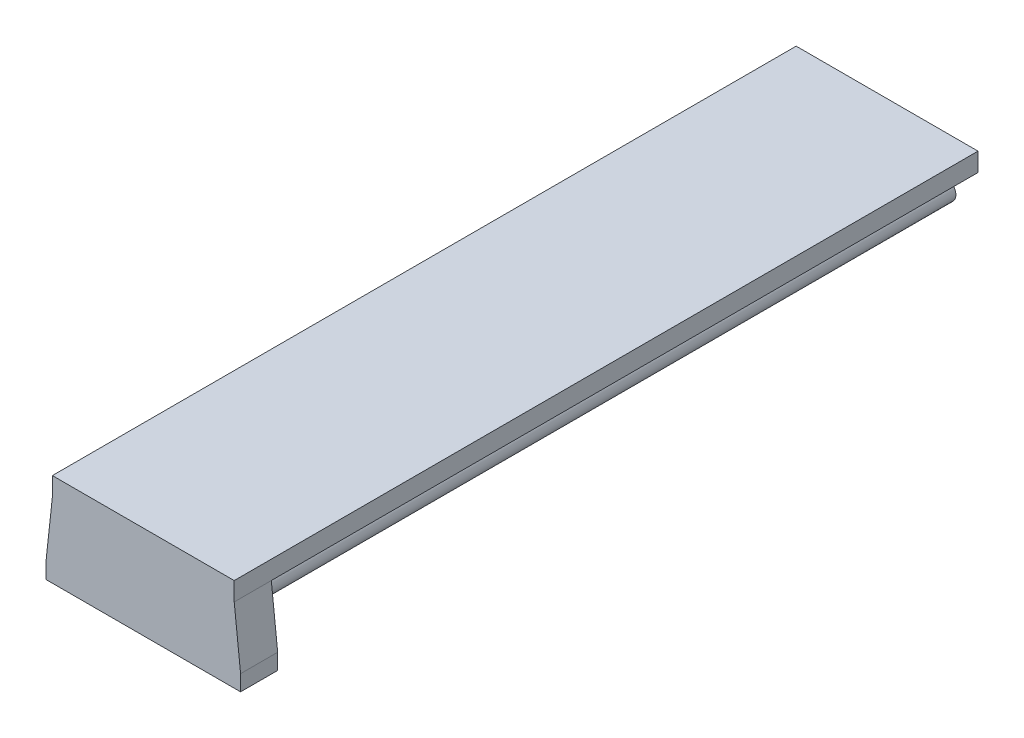
ISO-10303-21;
HEADER;
FILE_DESCRIPTION(('STEP AP214'),'2;1');
FILE_NAME('part.step','',(''),(''),'','','');
FILE_SCHEMA(('AUTOMOTIVE_DESIGN { 1 0 10303 214 1 1 1 1 }'));
ENDSEC;
DATA;
#1=APPLICATION_CONTEXT('core data for automotive mechanical design processes');
#2=APPLICATION_PROTOCOL_DEFINITION('international standard','automotive_design',2000,#1);
#3=PRODUCT_CONTEXT('',#1,'mechanical');
#4=PRODUCT('Part','Part','',(#3));
#5=PRODUCT_RELATED_PRODUCT_CATEGORY('part','',(#4));
#6=PRODUCT_DEFINITION_FORMATION('','',#4);
#7=PRODUCT_DEFINITION_CONTEXT('part definition',#1,'design');
#8=PRODUCT_DEFINITION('design','',#6,#7);
#9=PRODUCT_DEFINITION_SHAPE('','',#8);
#10=(LENGTH_UNIT() NAMED_UNIT(*) SI_UNIT(.MILLI.,.METRE.));
#11=(NAMED_UNIT(*) PLANE_ANGLE_UNIT() SI_UNIT($,.RADIAN.));
#12=(NAMED_UNIT(*) SI_UNIT($,.STERADIAN.) SOLID_ANGLE_UNIT());
#13=UNCERTAINTY_MEASURE_WITH_UNIT(LENGTH_MEASURE(1.E-05),#10,'distance_accuracy_value','');
#14=(GEOMETRIC_REPRESENTATION_CONTEXT(3) GLOBAL_UNCERTAINTY_ASSIGNED_CONTEXT((#13)) GLOBAL_UNIT_ASSIGNED_CONTEXT((#10,
#11,#12)) REPRESENTATION_CONTEXT('',''));
#15=CARTESIAN_POINT('',(0.,0.,0.));
#16=DIRECTION('',(0.,0.,1.));
#17=DIRECTION('',(1.,0.,0.));
#18=AXIS2_PLACEMENT_3D('',#15,#16,#17);
#19=CARTESIAN_POINT('',(0.,10.4902,-76.2));
#20=DIRECTION('',(0.,-1.,0.));
#21=DIRECTION('',(1.,0.,0.));
#22=AXIS2_PLACEMENT_3D('',#19,#20,#21);
#23=PLANE('',#22);
#24=DIRECTION('',(1.,0.,0.));
#25=VECTOR('',#24,1.);
#26=CARTESIAN_POINT('',(0.,10.4902,0.));
#27=LINE('',#26,#25);
#28=CARTESIAN_POINT('',(-6.34847801870124,10.4902,0.));
#29=VERTEX_POINT('',#28);
#30=CARTESIAN_POINT('',(-4.19036499999997,10.4902,0.));
#31=VERTEX_POINT('',#30);
#32=EDGE_CURVE('E227',#29,#31,#27,.T.);
#33=ORIENTED_EDGE('',*,*,#32,.T.);
#34=DIRECTION('',(0.,0.,1.));
#35=VECTOR('',#34,1.);
#36=CARTESIAN_POINT('',(-4.19036499999997,10.4902,-76.2));
#37=LINE('',#36,#35);
#38=CARTESIAN_POINT('',(-4.19036499999997,10.4902,-76.2));
#39=VERTEX_POINT('',#38);
#40=EDGE_CURVE('E11',#39,#31,#37,.T.);
#41=ORIENTED_EDGE('',*,*,#40,.F.);
#42=DIRECTION('',(1.,0.,0.));
#43=VECTOR('',#42,1.);
#44=CARTESIAN_POINT('',(0.,10.4902,-76.2));
#45=LINE('',#44,#43);
#46=CARTESIAN_POINT('',(-6.34847801870124,10.4902,-76.2));
#47=VERTEX_POINT('',#46);
#48=EDGE_CURVE('E236',#47,#39,#45,.T.);
#49=ORIENTED_EDGE('',*,*,#48,.F.);
#50=DIRECTION('',(0.,0.,1.));
#51=VECTOR('',#50,1.);
#52=CARTESIAN_POINT('',(-6.34847801870124,10.4902,-76.2));
#53=LINE('',#52,#51);
#54=EDGE_CURVE('E42',#47,#29,#53,.T.);
#55=ORIENTED_EDGE('',*,*,#54,.T.);
#56=EDGE_LOOP('',(#33,#41,#49,#55));
#57=FACE_BOUND('',#56,.T.);
#58=ADVANCED_FACE('F39',(#57),#23,.F.);
#59=CARTESIAN_POINT('',(-4.19036499999997,11.429365,-76.2));
#60=DIRECTION('',(0.,0.,1.));
#61=DIRECTION('',(1.,0.,0.));
#62=AXIS2_PLACEMENT_3D('',#59,#60,#61);
#63=CYLINDRICAL_SURFACE('',#62,0.939165);
#64=CARTESIAN_POINT('',(-4.19036499999997,11.429365,0.));
#65=DIRECTION('',(0.,0.,1.));
#66=DIRECTION('',(1.,0.,0.));
#67=AXIS2_PLACEMENT_3D('',#64,#65,#66);
#68=CIRCLE('',#67,0.939165);
#69=CARTESIAN_POINT('',(-3.25119999999997,11.429365,0.));
#70=VERTEX_POINT('',#69);
#71=EDGE_CURVE('E239',#31,#70,#68,.T.);
#72=ORIENTED_EDGE('',*,*,#71,.T.);
#73=DIRECTION('',(0.,0.,1.));
#74=VECTOR('',#73,1.);
#75=CARTESIAN_POINT('',(-3.25119999999997,11.429365,-76.2));
#76=LINE('',#75,#74);
#77=CARTESIAN_POINT('',(-3.25119999999997,11.429365,-76.2));
#78=VERTEX_POINT('',#77);
#79=EDGE_CURVE('E48',#78,#70,#76,.T.);
#80=ORIENTED_EDGE('',*,*,#79,.F.);
#81=CARTESIAN_POINT('',(-4.19036499999997,11.429365,-76.2));
#82=DIRECTION('',(0.,0.,1.));
#83=DIRECTION('',(1.,0.,0.));
#84=AXIS2_PLACEMENT_3D('',#81,#82,#83);
#85=CIRCLE('',#84,0.939165);
#86=EDGE_CURVE('E55',#39,#78,#85,.T.);
#87=ORIENTED_EDGE('',*,*,#86,.F.);
#88=ORIENTED_EDGE('',*,*,#40,.T.);
#89=EDGE_LOOP('',(#72,#80,#87,#88));
#90=FACE_BOUND('',#89,.T.);
#91=ADVANCED_FACE('F383',(#90),#63,.F.);
#92=CARTESIAN_POINT('',(-3.25119999999994,0.,-76.2));
#93=DIRECTION('',(1.,0.,0.));
#94=DIRECTION('',(0.,1.,0.));
#95=AXIS2_PLACEMENT_3D('',#92,#93,#94);
#96=PLANE('',#95);
#97=DIRECTION('',(0.,1.,0.));
#98=VECTOR('',#97,1.);
#99=CARTESIAN_POINT('',(-3.25119999999994,0.,0.));
#100=LINE('',#99,#98);
#101=CARTESIAN_POINT('',(-3.25119999999997,11.760835,0.));
#102=VERTEX_POINT('',#101);
#103=EDGE_CURVE('E318',#70,#102,#100,.T.);
#104=ORIENTED_EDGE('',*,*,#103,.T.);
#105=DIRECTION('',(0.,0.,1.));
#106=VECTOR('',#105,1.);
#107=CARTESIAN_POINT('',(-3.25119999999997,11.760835,-76.2));
#108=LINE('',#107,#106);
#109=CARTESIAN_POINT('',(-3.25119999999997,11.760835,-76.2));
#110=VERTEX_POINT('',#109);
#111=EDGE_CURVE('E325',#110,#102,#108,.T.);
#112=ORIENTED_EDGE('',*,*,#111,.F.);
#113=DIRECTION('',(0.,1.,0.));
#114=VECTOR('',#113,1.);
#115=CARTESIAN_POINT('',(-3.25119999999994,0.,-76.2));
#116=LINE('',#115,#114);
#117=EDGE_CURVE('E285',#78,#110,#116,.T.);
#118=ORIENTED_EDGE('',*,*,#117,.F.);
#119=ORIENTED_EDGE('',*,*,#79,.T.);
#120=EDGE_LOOP('',(#104,#112,#118,#119));
#121=FACE_BOUND('',#120,.T.);
#122=ADVANCED_FACE('F385',(#121),#96,.F.);
#123=CARTESIAN_POINT('',(-4.19036499999997,11.760835,-76.2));
#124=DIRECTION('',(0.,0.,1.));
#125=DIRECTION('',(1.,0.,0.));
#126=AXIS2_PLACEMENT_3D('',#123,#124,#125);
#127=CYLINDRICAL_SURFACE('',#126,0.939164999999999);
#128=CARTESIAN_POINT('',(-4.19036499999997,11.760835,0.));
#129=DIRECTION('',(0.,0.,1.));
#130=DIRECTION('',(1.,0.,0.));
#131=AXIS2_PLACEMENT_3D('',#128,#129,#130);
#132=CIRCLE('',#131,0.939164999999999);
#133=CARTESIAN_POINT('',(-4.19036499999997,12.7,0.));
#134=VERTEX_POINT('',#133);
#135=EDGE_CURVE('E315',#102,#134,#132,.T.);
#136=ORIENTED_EDGE('',*,*,#135,.T.);
#137=DIRECTION('',(0.,0.,1.));
#138=VECTOR('',#137,1.);
#139=CARTESIAN_POINT('',(-4.19036499999997,12.7,-76.2));
#140=LINE('',#139,#138);
#141=CARTESIAN_POINT('',(-4.19036499999997,12.7,-76.2));
#142=VERTEX_POINT('',#141);
#143=EDGE_CURVE('E328',#142,#134,#140,.T.);
#144=ORIENTED_EDGE('',*,*,#143,.F.);
#145=CARTESIAN_POINT('',(-4.19036499999997,11.760835,-76.2));
#146=DIRECTION('',(0.,0.,1.));
#147=DIRECTION('',(1.,0.,0.));
#148=AXIS2_PLACEMENT_3D('',#145,#146,#147);
#149=CIRCLE('',#148,0.939164999999999);
#150=EDGE_CURVE('E283',#110,#142,#149,.T.);
#151=ORIENTED_EDGE('',*,*,#150,.F.);
#152=ORIENTED_EDGE('',*,*,#111,.T.);
#153=EDGE_LOOP('',(#136,#144,#151,#152));
#154=FACE_BOUND('',#153,.T.);
#155=ADVANCED_FACE('F391',(#154),#127,.F.);
#156=CARTESIAN_POINT('',(0.,12.7,-76.2));
#157=DIRECTION('',(0.,1.,0.));
#158=DIRECTION('',(0.,0.,1.));
#159=AXIS2_PLACEMENT_3D('',#156,#157,#158);
#160=PLANE('',#159);
#161=DIRECTION('',(-1.,0.,0.));
#162=VECTOR('',#161,1.);
#163=CARTESIAN_POINT('',(0.,12.7,0.));
#164=LINE('',#163,#162);
#165=CARTESIAN_POINT('',(-9.80370315240092,12.7,0.));
#166=VERTEX_POINT('',#165);
#167=EDGE_CURVE('E312',#134,#166,#164,.T.);
#168=ORIENTED_EDGE('',*,*,#167,.T.);
#169=DIRECTION('',(0.,0.,1.));
#170=VECTOR('',#169,1.);
#171=CARTESIAN_POINT('',(-9.80370315240092,12.7,-76.2));
#172=LINE('',#171,#170);
#173=CARTESIAN_POINT('',(-9.80370315240092,12.7,-76.2));
#174=VERTEX_POINT('',#173);
#175=EDGE_CURVE('E331',#174,#166,#172,.T.);
#176=ORIENTED_EDGE('',*,*,#175,.F.);
#177=DIRECTION('',(-1.,0.,0.));
#178=VECTOR('',#177,1.);
#179=CARTESIAN_POINT('',(0.,12.7,-76.2));
#180=LINE('',#179,#178);
#181=EDGE_CURVE('E281',#142,#174,#180,.T.);
#182=ORIENTED_EDGE('',*,*,#181,.F.);
#183=ORIENTED_EDGE('',*,*,#143,.T.);
#184=EDGE_LOOP('',(#168,#176,#182,#183));
#185=FACE_BOUND('',#184,.T.);
#186=ADVANCED_FACE('F400',(#185),#160,.F.);
#187=CARTESIAN_POINT('',(-9.80370315240092,0.,-76.2));
#188=DIRECTION('',(-1.,0.,0.));
#189=DIRECTION('',(0.,0.,1.));
#190=AXIS2_PLACEMENT_3D('',#187,#188,#189);
#191=PLANE('',#190);
#192=ORIENTED_EDGE('',*,*,#175,.T.);
#193=DIRECTION('',(0.,0.,-1.));
#194=VECTOR('',#193,1.);
#195=CARTESIAN_POINT('',(-9.80370315240092,12.7,4.));
#196=LINE('',#195,#194);
#197=CARTESIAN_POINT('',(-9.80370315240092,12.7,4.));
#198=VERTEX_POINT('',#197);
#199=EDGE_CURVE('E494',#198,#166,#196,.T.);
#200=ORIENTED_EDGE('',*,*,#199,.F.);
#201=DIRECTION('',(0.,-1.,0.));
#202=VECTOR('',#201,1.);
#203=CARTESIAN_POINT('',(-9.80370315240092,0.,4.));
#204=LINE('',#203,#202);
#205=CARTESIAN_POINT('',(-9.80370315240092,14.7,4.));
#206=VERTEX_POINT('',#205);
#207=EDGE_CURVE('E514',#206,#198,#204,.T.);
#208=ORIENTED_EDGE('',*,*,#207,.F.);
#209=DIRECTION('',(0.,0.,1.));
#210=VECTOR('',#209,1.);
#211=CARTESIAN_POINT('',(-9.80370315240092,14.7,-76.2));
#212=LINE('',#211,#210);
#213=CARTESIAN_POINT('',(-9.80370315240092,14.7,-76.2));
#214=VERTEX_POINT('',#213);
#215=EDGE_CURVE('E334',#214,#206,#212,.T.);
#216=ORIENTED_EDGE('',*,*,#215,.F.);
#217=DIRECTION('',(0.,-1.,0.));
#218=VECTOR('',#217,1.);
#219=CARTESIAN_POINT('',(-9.80370315240092,0.,-76.2));
#220=LINE('',#219,#218);
#221=EDGE_CURVE('E278',#214,#174,#220,.T.);
#222=ORIENTED_EDGE('',*,*,#221,.T.);
#223=EDGE_LOOP('',(#192,#200,#208,#216,#222));
#224=FACE_BOUND('',#223,.T.);
#225=ADVANCED_FACE('F404',(#224),#191,.T.);
#226=CARTESIAN_POINT('',(0.,14.7,-76.2));
#227=DIRECTION('',(0.,1.,0.));
#228=DIRECTION('',(-1.,0.,0.));
#229=AXIS2_PLACEMENT_3D('',#226,#227,#228);
#230=PLANE('',#229);
#231=ORIENTED_EDGE('',*,*,#215,.T.);
#232=DIRECTION('',(-1.,0.,0.));
#233=VECTOR('',#232,1.);
#234=CARTESIAN_POINT('',(0.,14.7,4.));
#235=LINE('',#234,#233);
#236=CARTESIAN_POINT('',(9.80370315240098,14.7,4.));
#237=VERTEX_POINT('',#236);
#238=EDGE_CURVE('E511',#237,#206,#235,.T.);
#239=ORIENTED_EDGE('',*,*,#238,.F.);
#240=DIRECTION('',(0.,0.,1.));
#241=VECTOR('',#240,1.);
#242=CARTESIAN_POINT('',(9.80370315240098,14.7,-76.2));
#243=LINE('',#242,#241);
#244=CARTESIAN_POINT('',(9.80370315240098,14.7,-76.2));
#245=VERTEX_POINT('',#244);
#246=EDGE_CURVE('E336',#245,#237,#243,.T.);
#247=ORIENTED_EDGE('',*,*,#246,.F.);
#248=DIRECTION('',(-1.,0.,0.));
#249=VECTOR('',#248,1.);
#250=CARTESIAN_POINT('',(0.,14.7,-76.2));
#251=LINE('',#250,#249);
#252=EDGE_CURVE('E275',#245,#214,#251,.T.);
#253=ORIENTED_EDGE('',*,*,#252,.T.);
#254=EDGE_LOOP('',(#231,#239,#247,#253));
#255=FACE_BOUND('',#254,.T.);
#256=ADVANCED_FACE('F408',(#255),#230,.T.);
#257=CARTESIAN_POINT('',(9.80370315240098,0.,-76.2));
#258=DIRECTION('',(1.,0.,0.));
#259=DIRECTION('',(0.,0.,-1.));
#260=AXIS2_PLACEMENT_3D('',#257,#258,#259);
#261=PLANE('',#260);
#262=ORIENTED_EDGE('',*,*,#246,.T.);
#263=DIRECTION('',(0.,1.,0.));
#264=VECTOR('',#263,1.);
#265=CARTESIAN_POINT('',(9.80370315240098,0.,4.));
#266=LINE('',#265,#264);
#267=CARTESIAN_POINT('',(9.80370315240098,12.7,4.));
#268=VERTEX_POINT('',#267);
#269=EDGE_CURVE('E500',#268,#237,#266,.T.);
#270=ORIENTED_EDGE('',*,*,#269,.F.);
#271=DIRECTION('',(0.,0.,-1.));
#272=VECTOR('',#271,1.);
#273=CARTESIAN_POINT('',(9.80370315240098,12.7,4.));
#274=LINE('',#273,#272);
#275=CARTESIAN_POINT('',(9.80370315240098,12.7,0.));
#276=VERTEX_POINT('',#275);
#277=EDGE_CURVE('E232',#268,#276,#274,.T.);
#278=ORIENTED_EDGE('',*,*,#277,.T.);
#279=DIRECTION('',(0.,0.,1.));
#280=VECTOR('',#279,1.);
#281=CARTESIAN_POINT('',(9.80370315240098,12.7,-76.2));
#282=LINE('',#281,#280);
#283=CARTESIAN_POINT('',(9.80370315240098,12.7,-76.2));
#284=VERTEX_POINT('',#283);
#285=EDGE_CURVE('E338',#284,#276,#282,.T.);
#286=ORIENTED_EDGE('',*,*,#285,.F.);
#287=DIRECTION('',(0.,1.,0.));
#288=VECTOR('',#287,1.);
#289=CARTESIAN_POINT('',(9.80370315240098,0.,-76.2));
#290=LINE('',#289,#288);
#291=EDGE_CURVE('E272',#284,#245,#290,.T.);
#292=ORIENTED_EDGE('',*,*,#291,.T.);
#293=EDGE_LOOP('',(#262,#270,#278,#286,#292));
#294=FACE_BOUND('',#293,.T.);
#295=ADVANCED_FACE('F412',(#294),#261,.T.);
#296=CARTESIAN_POINT('',(0.,12.7,-76.2));
#297=DIRECTION('',(0.,-1.,0.));
#298=DIRECTION('',(0.,0.,-1.));
#299=AXIS2_PLACEMENT_3D('',#296,#297,#298);
#300=PLANE('',#299);
#301=DIRECTION('',(1.,0.,0.));
#302=VECTOR('',#301,1.);
#303=CARTESIAN_POINT('',(0.,12.7,0.));
#304=LINE('',#303,#302);
#305=CARTESIAN_POINT('',(4.19036500000003,12.7,0.));
#306=VERTEX_POINT('',#305);
#307=EDGE_CURVE('E310',#306,#276,#304,.T.);
#308=ORIENTED_EDGE('',*,*,#307,.F.);
#309=DIRECTION('',(0.,0.,1.));
#310=VECTOR('',#309,1.);
#311=CARTESIAN_POINT('',(4.19036500000003,12.7,-76.2));
#312=LINE('',#311,#310);
#313=CARTESIAN_POINT('',(4.19036500000003,12.7,-76.2));
#314=VERTEX_POINT('',#313);
#315=EDGE_CURVE('E341',#314,#306,#312,.T.);
#316=ORIENTED_EDGE('',*,*,#315,.F.);
#317=DIRECTION('',(1.,0.,0.));
#318=VECTOR('',#317,1.);
#319=CARTESIAN_POINT('',(0.,12.7,-76.2));
#320=LINE('',#319,#318);
#321=EDGE_CURVE('E269',#314,#284,#320,.T.);
#322=ORIENTED_EDGE('',*,*,#321,.T.);
#323=ORIENTED_EDGE('',*,*,#285,.T.);
#324=EDGE_LOOP('',(#308,#316,#322,#323));
#325=FACE_BOUND('',#324,.T.);
#326=ADVANCED_FACE('F416',(#325),#300,.T.);
#327=CARTESIAN_POINT('',(4.19036500000003,11.760835,-76.2));
#328=DIRECTION('',(0.,0.,1.));
#329=DIRECTION('',(1.,0.,0.));
#330=AXIS2_PLACEMENT_3D('',#327,#328,#329);
#331=CYLINDRICAL_SURFACE('',#330,0.939164999999999);
#332=CARTESIAN_POINT('',(4.19036500000003,11.760835,0.));
#333=DIRECTION('',(0.,0.,1.));
#334=DIRECTION('',(1.,0.,0.));
#335=AXIS2_PLACEMENT_3D('',#332,#333,#334);
#336=CIRCLE('',#335,0.939164999999999);
#337=CARTESIAN_POINT('',(3.25120000000003,11.760835,0.));
#338=VERTEX_POINT('',#337);
#339=EDGE_CURVE('E307',#306,#338,#336,.T.);
#340=ORIENTED_EDGE('',*,*,#339,.T.);
#341=DIRECTION('',(0.,0.,1.));
#342=VECTOR('',#341,1.);
#343=CARTESIAN_POINT('',(3.25120000000003,11.760835,-76.2));
#344=LINE('',#343,#342);
#345=CARTESIAN_POINT('',(3.25120000000003,11.760835,-76.2));
#346=VERTEX_POINT('',#345);
#347=EDGE_CURVE('E344',#346,#338,#344,.T.);
#348=ORIENTED_EDGE('',*,*,#347,.F.);
#349=CARTESIAN_POINT('',(4.19036500000003,11.760835,-76.2));
#350=DIRECTION('',(0.,0.,1.));
#351=DIRECTION('',(1.,0.,0.));
#352=AXIS2_PLACEMENT_3D('',#349,#350,#351);
#353=CIRCLE('',#352,0.939164999999999);
#354=EDGE_CURVE('E267',#314,#346,#353,.T.);
#355=ORIENTED_EDGE('',*,*,#354,.F.);
#356=ORIENTED_EDGE('',*,*,#315,.T.);
#357=EDGE_LOOP('',(#340,#348,#355,#356));
#358=FACE_BOUND('',#357,.T.);
#359=ADVANCED_FACE('F420',(#358),#331,.F.);
#360=CARTESIAN_POINT('',(3.2512,0.,-76.2));
#361=DIRECTION('',(1.,0.,0.));
#362=DIRECTION('',(0.,1.,0.));
#363=AXIS2_PLACEMENT_3D('',#360,#361,#362);
#364=PLANE('',#363);
#365=DIRECTION('',(0.,1.,0.));
#366=VECTOR('',#365,1.);
#367=CARTESIAN_POINT('',(3.2512,0.,0.));
#368=LINE('',#367,#366);
#369=CARTESIAN_POINT('',(3.25120000000003,11.429365,0.));
#370=VERTEX_POINT('',#369);
#371=EDGE_CURVE('E305',#370,#338,#368,.T.);
#372=ORIENTED_EDGE('',*,*,#371,.F.);
#373=DIRECTION('',(0.,0.,1.));
#374=VECTOR('',#373,1.);
#375=CARTESIAN_POINT('',(3.25120000000003,11.429365,-76.2));
#376=LINE('',#375,#374);
#377=CARTESIAN_POINT('',(3.25120000000003,11.429365,-76.2));
#378=VERTEX_POINT('',#377);
#379=EDGE_CURVE('E347',#378,#370,#376,.T.);
#380=ORIENTED_EDGE('',*,*,#379,.F.);
#381=DIRECTION('',(0.,1.,0.));
#382=VECTOR('',#381,1.);
#383=CARTESIAN_POINT('',(3.2512,0.,-76.2));
#384=LINE('',#383,#382);
#385=EDGE_CURVE('E264',#378,#346,#384,.T.);
#386=ORIENTED_EDGE('',*,*,#385,.T.);
#387=ORIENTED_EDGE('',*,*,#347,.T.);
#388=EDGE_LOOP('',(#372,#380,#386,#387));
#389=FACE_BOUND('',#388,.T.);
#390=ADVANCED_FACE('F424',(#389),#364,.T.);
#391=CARTESIAN_POINT('',(4.19036500000003,11.429365,-76.2));
#392=DIRECTION('',(0.,0.,1.));
#393=DIRECTION('',(1.,0.,0.));
#394=AXIS2_PLACEMENT_3D('',#391,#392,#393);
#395=CYLINDRICAL_SURFACE('',#394,0.939165);
#396=CARTESIAN_POINT('',(4.19036500000003,11.429365,0.));
#397=DIRECTION('',(0.,0.,1.));
#398=DIRECTION('',(1.,0.,0.));
#399=AXIS2_PLACEMENT_3D('',#396,#397,#398);
#400=CIRCLE('',#399,0.939165);
#401=CARTESIAN_POINT('',(4.19036500000003,10.4902,0.));
#402=VERTEX_POINT('',#401);
#403=EDGE_CURVE('E302',#370,#402,#400,.T.);
#404=ORIENTED_EDGE('',*,*,#403,.T.);
#405=DIRECTION('',(0.,0.,1.));
#406=VECTOR('',#405,1.);
#407=CARTESIAN_POINT('',(4.19036500000003,10.4902,-76.2));
#408=LINE('',#407,#406);
#409=CARTESIAN_POINT('',(4.19036500000003,10.4902,-76.2));
#410=VERTEX_POINT('',#409);
#411=EDGE_CURVE('E350',#410,#402,#408,.T.);
#412=ORIENTED_EDGE('',*,*,#411,.F.);
#413=CARTESIAN_POINT('',(4.19036500000003,11.429365,-76.2));
#414=DIRECTION('',(0.,0.,1.));
#415=DIRECTION('',(1.,0.,0.));
#416=AXIS2_PLACEMENT_3D('',#413,#414,#415);
#417=CIRCLE('',#416,0.939165);
#418=EDGE_CURVE('E262',#378,#410,#417,.T.);
#419=ORIENTED_EDGE('',*,*,#418,.F.);
#420=ORIENTED_EDGE('',*,*,#379,.T.);
#421=EDGE_LOOP('',(#404,#412,#419,#420));
#422=FACE_BOUND('',#421,.T.);
#423=ADVANCED_FACE('F428',(#422),#395,.F.);
#424=CARTESIAN_POINT('',(0.,10.4902,-76.2));
#425=DIRECTION('',(0.,1.,0.));
#426=DIRECTION('',(-1.,0.,0.));
#427=AXIS2_PLACEMENT_3D('',#424,#425,#426);
#428=PLANE('',#427);
#429=DIRECTION('',(-1.,0.,0.));
#430=VECTOR('',#429,1.);
#431=CARTESIAN_POINT('',(0.,10.4902,0.));
#432=LINE('',#431,#430);
#433=CARTESIAN_POINT('',(6.34847801870129,10.4902,0.));
#434=VERTEX_POINT('',#433);
#435=EDGE_CURVE('E300',#434,#402,#432,.T.);
#436=ORIENTED_EDGE('',*,*,#435,.F.);
#437=DIRECTION('',(0.,0.,1.));
#438=VECTOR('',#437,1.);
#439=CARTESIAN_POINT('',(6.34847801870129,10.4902,-76.2));
#440=LINE('',#439,#438);
#441=CARTESIAN_POINT('',(6.34847801870129,10.4902,-76.2));
#442=VERTEX_POINT('',#441);
#443=EDGE_CURVE('E353',#442,#434,#440,.T.);
#444=ORIENTED_EDGE('',*,*,#443,.F.);
#445=DIRECTION('',(-1.,0.,0.));
#446=VECTOR('',#445,1.);
#447=CARTESIAN_POINT('',(0.,10.4902,-76.2));
#448=LINE('',#447,#446);
#449=EDGE_CURVE('E259',#442,#410,#448,.T.);
#450=ORIENTED_EDGE('',*,*,#449,.T.);
#451=ORIENTED_EDGE('',*,*,#411,.T.);
#452=EDGE_LOOP('',(#436,#444,#450,#451));
#453=FACE_BOUND('',#452,.T.);
#454=ADVANCED_FACE('F432',(#453),#428,.T.);
#455=CARTESIAN_POINT('',(6.34847801870129,9.42187801870127,-76.2));
#456=DIRECTION('',(0.,0.,1.));
#457=DIRECTION('',(1.,0.,0.));
#458=AXIS2_PLACEMENT_3D('',#455,#456,#457);
#459=CYLINDRICAL_SURFACE('',#458,1.06832198129874);
#460=CARTESIAN_POINT('',(6.34847801870129,9.42187801870127,0.));
#461=DIRECTION('',(0.,0.,1.));
#462=DIRECTION('',(1.,0.,0.));
#463=AXIS2_PLACEMENT_3D('',#460,#461,#462);
#464=CIRCLE('',#463,1.06832198129874);
#465=CARTESIAN_POINT('',(7.10389573616828,8.66646030123428,0.));
#466=VERTEX_POINT('',#465);
#467=EDGE_CURVE('E298',#466,#434,#464,.T.);
#468=ORIENTED_EDGE('',*,*,#467,.F.);
#469=DIRECTION('',(0.,0.,1.));
#470=VECTOR('',#469,1.);
#471=CARTESIAN_POINT('',(7.10389573616828,8.66646030123428,-76.2));
#472=LINE('',#471,#470);
#473=CARTESIAN_POINT('',(7.10389573616828,8.66646030123428,-76.2));
#474=VERTEX_POINT('',#473);
#475=EDGE_CURVE('E356',#474,#466,#472,.T.);
#476=ORIENTED_EDGE('',*,*,#475,.F.);
#477=CARTESIAN_POINT('',(6.34847801870129,9.42187801870127,-76.2));
#478=DIRECTION('',(0.,0.,1.));
#479=DIRECTION('',(1.,0.,0.));
#480=AXIS2_PLACEMENT_3D('',#477,#478,#479);
#481=CIRCLE('',#480,1.06832198129874);
#482=EDGE_CURVE('E256',#474,#442,#481,.T.);
#483=ORIENTED_EDGE('',*,*,#482,.T.);
#484=ORIENTED_EDGE('',*,*,#443,.T.);
#485=EDGE_LOOP('',(#468,#476,#483,#484));
#486=FACE_BOUND('',#485,.T.);
#487=ADVANCED_FACE('F436',(#486),#459,.T.);
#488=CARTESIAN_POINT('',(-0.781282282533002,0.781282282533002,-76.2));
#489=DIRECTION('',(0.707106781186548,-0.707106781186547,0.));
#490=DIRECTION('',(0.707106781186547,0.707106781186548,0.));
#491=AXIS2_PLACEMENT_3D('',#488,#489,#490);
#492=PLANE('',#491);
#493=DIRECTION('',(0.707106781186547,0.707106781186548,0.));
#494=VECTOR('',#493,1.);
#495=CARTESIAN_POINT('',(-0.781282282533002,0.781282282533002,0.));
#496=LINE('',#495,#494);
#497=CARTESIAN_POINT('',(3.73733456252268,5.29989912758868,0.));
#498=VERTEX_POINT('',#497);
#499=EDGE_CURVE('E296',#498,#466,#496,.T.);
#500=ORIENTED_EDGE('',*,*,#499,.F.);
#501=DIRECTION('',(0.,0.,1.));
#502=VECTOR('',#501,1.);
#503=CARTESIAN_POINT('',(3.73733456252268,5.29989912758868,-76.2));
#504=LINE('',#503,#502);
#505=CARTESIAN_POINT('',(3.73733456252268,5.29989912758868,-76.2));
#506=VERTEX_POINT('',#505);
#507=EDGE_CURVE('E359',#506,#498,#504,.T.);
#508=ORIENTED_EDGE('',*,*,#507,.F.);
#509=DIRECTION('',(0.707106781186547,0.707106781186548,0.));
#510=VECTOR('',#509,1.);
#511=CARTESIAN_POINT('',(-0.781282282533002,0.781282282533002,-76.2));
#512=LINE('',#511,#510);
#513=EDGE_CURVE('E253',#506,#474,#512,.T.);
#514=ORIENTED_EDGE('',*,*,#513,.T.);
#515=ORIENTED_EDGE('',*,*,#475,.T.);
#516=EDGE_LOOP('',(#500,#508,#514,#515));
#517=FACE_BOUND('',#516,.T.);
#518=ADVANCED_FACE('F440',(#517),#492,.T.);
#519=CARTESIAN_POINT('',(2.16399369011136,6.87324,-76.2));
#520=DIRECTION('',(0.,0.,1.));
#521=DIRECTION('',(1.,0.,0.));
#522=AXIS2_PLACEMENT_3D('',#519,#520,#521);
#523=CYLINDRICAL_SURFACE('',#522,2.22504);
#524=CARTESIAN_POINT('',(2.16399369011136,6.87324,0.));
#525=DIRECTION('',(0.,0.,1.));
#526=DIRECTION('',(1.,0.,0.));
#527=AXIS2_PLACEMENT_3D('',#524,#525,#526);
#528=CIRCLE('',#527,2.22504);
#529=CARTESIAN_POINT('',(2.16399369011136,4.6482,0.));
#530=VERTEX_POINT('',#529);
#531=EDGE_CURVE('E294',#530,#498,#528,.T.);
#532=ORIENTED_EDGE('',*,*,#531,.F.);
#533=DIRECTION('',(0.,0.,1.));
#534=VECTOR('',#533,1.);
#535=CARTESIAN_POINT('',(2.16399369011136,4.6482,-76.2));
#536=LINE('',#535,#534);
#537=CARTESIAN_POINT('',(2.16399369011136,4.6482,-76.2));
#538=VERTEX_POINT('',#537);
#539=EDGE_CURVE('E362',#538,#530,#536,.T.);
#540=ORIENTED_EDGE('',*,*,#539,.F.);
#541=CARTESIAN_POINT('',(2.16399369011136,6.87324,-76.2));
#542=DIRECTION('',(0.,0.,1.));
#543=DIRECTION('',(1.,0.,0.));
#544=AXIS2_PLACEMENT_3D('',#541,#542,#543);
#545=CIRCLE('',#544,2.22504);
#546=EDGE_CURVE('E250',#538,#506,#545,.T.);
#547=ORIENTED_EDGE('',*,*,#546,.T.);
#548=ORIENTED_EDGE('',*,*,#507,.T.);
#549=EDGE_LOOP('',(#532,#540,#547,#548));
#550=FACE_BOUND('',#549,.T.);
#551=ADVANCED_FACE('F444',(#550),#523,.T.);
#552=CARTESIAN_POINT('',(0.,4.6482,-76.2));
#553=DIRECTION('',(0.,-1.,0.));
#554=DIRECTION('',(0.,0.,-1.));
#555=AXIS2_PLACEMENT_3D('',#552,#553,#554);
#556=PLANE('',#555);
#557=ORIENTED_EDGE('',*,*,#539,.T.);
#558=DIRECTION('',(1.,0.,0.));
#559=VECTOR('',#558,1.);
#560=CARTESIAN_POINT('',(0.,4.6482,0.));
#561=LINE('',#560,#559);
#562=CARTESIAN_POINT('',(10.4902,4.6482,0.));
#563=VERTEX_POINT('',#562);
#564=EDGE_CURVE('E225',#530,#563,#561,.T.);
#565=ORIENTED_EDGE('',*,*,#564,.T.);
#566=DIRECTION('',(0.,0.,-1.));
#567=VECTOR('',#566,1.);
#568=CARTESIAN_POINT('',(10.4902,4.6482,4.));
#569=LINE('',#568,#567);
#570=CARTESIAN_POINT('',(10.4902,4.6482,4.));
#571=VERTEX_POINT('',#570);
#572=EDGE_CURVE('E206',#571,#563,#569,.T.);
#573=ORIENTED_EDGE('',*,*,#572,.F.);
#574=DIRECTION('',(1.,0.,0.));
#575=VECTOR('',#574,1.);
#576=CARTESIAN_POINT('',(0.,4.6482,4.));
#577=LINE('',#576,#575);
#578=CARTESIAN_POINT('',(-10.4902,4.6482,4.));
#579=VERTEX_POINT('',#578);
#580=EDGE_CURVE('E212',#579,#571,#577,.T.);
#581=ORIENTED_EDGE('',*,*,#580,.F.);
#582=DIRECTION('',(0.,0.,-1.));
#583=VECTOR('',#582,1.);
#584=CARTESIAN_POINT('',(-10.4902,4.6482,4.));
#585=LINE('',#584,#583);
#586=CARTESIAN_POINT('',(-10.4902,4.6482,0.));
#587=VERTEX_POINT('',#586);
#588=EDGE_CURVE('E477',#579,#587,#585,.T.);
#589=ORIENTED_EDGE('',*,*,#588,.T.);
#590=CARTESIAN_POINT('',(-2.16399369011131,4.6482,0.));
#591=VERTEX_POINT('',#590);
#592=EDGE_CURVE('E476',#587,#591,#561,.T.);
#593=ORIENTED_EDGE('',*,*,#592,.T.);
#594=DIRECTION('',(0.,0.,1.));
#595=VECTOR('',#594,1.);
#596=CARTESIAN_POINT('',(-2.16399369011131,4.6482,-76.2));
#597=LINE('',#596,#595);
#598=CARTESIAN_POINT('',(-2.16399369011131,4.6482,-76.2));
#599=VERTEX_POINT('',#598);
#600=EDGE_CURVE('E364',#599,#591,#597,.T.);
#601=ORIENTED_EDGE('',*,*,#600,.F.);
#602=DIRECTION('',(1.,0.,0.));
#603=VECTOR('',#602,1.);
#604=CARTESIAN_POINT('',(0.,4.6482,-76.2));
#605=LINE('',#604,#603);
#606=EDGE_CURVE('E247',#599,#538,#605,.T.);
#607=ORIENTED_EDGE('',*,*,#606,.T.);
#608=EDGE_LOOP('',(#557,#565,#573,#581,#589,#593,#601,#607));
#609=FACE_BOUND('',#608,.T.);
#610=ADVANCED_FACE('F224',(#609),#556,.T.);
#611=CARTESIAN_POINT('',(-2.16399369011131,6.87324,-76.2));
#612=DIRECTION('',(0.,0.,1.));
#613=DIRECTION('',(1.,0.,0.));
#614=AXIS2_PLACEMENT_3D('',#611,#612,#613);
#615=CYLINDRICAL_SURFACE('',#614,2.22504);
#616=CARTESIAN_POINT('',(-2.16399369011131,6.87324,0.));
#617=DIRECTION('',(0.,0.,1.));
#618=DIRECTION('',(1.,0.,0.));
#619=AXIS2_PLACEMENT_3D('',#616,#617,#618);
#620=CIRCLE('',#619,2.22504);
#621=CARTESIAN_POINT('',(-3.73733456252262,5.29989912758868,0.));
#622=VERTEX_POINT('',#621);
#623=EDGE_CURVE('E292',#622,#591,#620,.T.);
#624=ORIENTED_EDGE('',*,*,#623,.F.);
#625=DIRECTION('',(0.,0.,1.));
#626=VECTOR('',#625,1.);
#627=CARTESIAN_POINT('',(-3.73733456252262,5.29989912758868,-76.2));
#628=LINE('',#627,#626);
#629=CARTESIAN_POINT('',(-3.73733456252262,5.29989912758868,-76.2));
#630=VERTEX_POINT('',#629);
#631=EDGE_CURVE('E367',#630,#622,#628,.T.);
#632=ORIENTED_EDGE('',*,*,#631,.F.);
#633=CARTESIAN_POINT('',(-2.16399369011131,6.87324,-76.2));
#634=DIRECTION('',(0.,0.,1.));
#635=DIRECTION('',(1.,0.,0.));
#636=AXIS2_PLACEMENT_3D('',#633,#634,#635);
#637=CIRCLE('',#636,2.22504);
#638=EDGE_CURVE('E244',#630,#599,#637,.T.);
#639=ORIENTED_EDGE('',*,*,#638,.T.);
#640=ORIENTED_EDGE('',*,*,#600,.T.);
#641=EDGE_LOOP('',(#624,#632,#639,#640));
#642=FACE_BOUND('',#641,.T.);
#643=ADVANCED_FACE('F451',(#642),#615,.T.);
#644=CARTESIAN_POINT('',(0.78128228253303,0.78128228253303,-76.2));
#645=DIRECTION('',(0.707106781186548,0.707106781186547,0.));
#646=DIRECTION('',(-0.707106781186547,0.707106781186548,0.));
#647=AXIS2_PLACEMENT_3D('',#644,#645,#646);
#648=PLANE('',#647);
#649=DIRECTION('',(-0.707106781186547,0.707106781186548,0.));
#650=VECTOR('',#649,1.);
#651=CARTESIAN_POINT('',(0.78128228253303,0.78128228253303,0.));
#652=LINE('',#651,#650);
#653=CARTESIAN_POINT('',(-7.10389573616822,8.66646030123428,0.));
#654=VERTEX_POINT('',#653);
#655=EDGE_CURVE('E289',#622,#654,#652,.T.);
#656=ORIENTED_EDGE('',*,*,#655,.T.);
#657=DIRECTION('',(0.,0.,1.));
#658=VECTOR('',#657,1.);
#659=CARTESIAN_POINT('',(-7.10389573616822,8.66646030123428,-76.2));
#660=LINE('',#659,#658);
#661=CARTESIAN_POINT('',(-7.10389573616822,8.66646030123428,-76.2));
#662=VERTEX_POINT('',#661);
#663=EDGE_CURVE('E369',#662,#654,#660,.T.);
#664=ORIENTED_EDGE('',*,*,#663,.F.);
#665=DIRECTION('',(-0.707106781186547,0.707106781186548,0.));
#666=VECTOR('',#665,1.);
#667=CARTESIAN_POINT('',(0.78128228253303,0.78128228253303,-76.2));
#668=LINE('',#667,#666);
#669=EDGE_CURVE('E242',#630,#662,#668,.T.);
#670=ORIENTED_EDGE('',*,*,#669,.F.);
#671=ORIENTED_EDGE('',*,*,#631,.T.);
#672=EDGE_LOOP('',(#656,#664,#670,#671));
#673=FACE_BOUND('',#672,.T.);
#674=ADVANCED_FACE('F454',(#673),#648,.F.);
#675=CARTESIAN_POINT('',(-6.34847801870124,9.42187801870127,-76.2));
#676=DIRECTION('',(0.,0.,1.));
#677=DIRECTION('',(1.,0.,0.));
#678=AXIS2_PLACEMENT_3D('',#675,#676,#677);
#679=CYLINDRICAL_SURFACE('',#678,1.06832198129874);
#680=CARTESIAN_POINT('',(-6.34847801870124,9.42187801870127,0.));
#681=DIRECTION('',(0.,0.,1.));
#682=DIRECTION('',(1.,0.,0.));
#683=AXIS2_PLACEMENT_3D('',#680,#681,#682);
#684=CIRCLE('',#683,1.06832198129874);
#685=EDGE_CURVE('E230',#29,#654,#684,.T.);
#686=ORIENTED_EDGE('',*,*,#685,.F.);
#687=ORIENTED_EDGE('',*,*,#54,.F.);
#688=CARTESIAN_POINT('',(-6.34847801870124,9.42187801870127,-76.2));
#689=DIRECTION('',(0.,0.,1.));
#690=DIRECTION('',(1.,0.,0.));
#691=AXIS2_PLACEMENT_3D('',#688,#689,#690);
#692=CIRCLE('',#691,1.06832198129874);
#693=EDGE_CURVE('E238',#47,#662,#692,.T.);
#694=ORIENTED_EDGE('',*,*,#693,.T.);
#695=ORIENTED_EDGE('',*,*,#663,.T.);
#696=EDGE_LOOP('',(#686,#687,#694,#695));
#697=FACE_BOUND('',#696,.T.);
#698=ADVANCED_FACE('F379',(#697),#679,.T.);
#699=CARTESIAN_POINT('',(0.,0.,-76.2));
#700=DIRECTION('',(0.,0.,1.));
#701=DIRECTION('',(1.,0.,0.));
#702=AXIS2_PLACEMENT_3D('',#699,#700,#701);
#703=PLANE('',#702);
#704=ORIENTED_EDGE('',*,*,#48,.T.);
#705=ORIENTED_EDGE('',*,*,#86,.T.);
#706=ORIENTED_EDGE('',*,*,#117,.T.);
#707=ORIENTED_EDGE('',*,*,#150,.T.);
#708=ORIENTED_EDGE('',*,*,#181,.T.);
#709=ORIENTED_EDGE('',*,*,#221,.F.);
#710=ORIENTED_EDGE('',*,*,#252,.F.);
#711=ORIENTED_EDGE('',*,*,#291,.F.);
#712=ORIENTED_EDGE('',*,*,#321,.F.);
#713=ORIENTED_EDGE('',*,*,#354,.T.);
#714=ORIENTED_EDGE('',*,*,#385,.F.);
#715=ORIENTED_EDGE('',*,*,#418,.T.);
#716=ORIENTED_EDGE('',*,*,#449,.F.);
#717=ORIENTED_EDGE('',*,*,#482,.F.);
#718=ORIENTED_EDGE('',*,*,#513,.F.);
#719=ORIENTED_EDGE('',*,*,#546,.F.);
#720=ORIENTED_EDGE('',*,*,#606,.F.);
#721=ORIENTED_EDGE('',*,*,#638,.F.);
#722=ORIENTED_EDGE('',*,*,#669,.T.);
#723=ORIENTED_EDGE('',*,*,#693,.F.);
#724=EDGE_LOOP('',(#704,#705,#706,#707,#708,#709,#710,#711,#712,#713,#714,#715,#716,#717,#718,
#719,#720,#721,#722,#723));
#725=FACE_BOUND('',#724,.T.);
#726=ADVANCED_FACE('F395',(#725),#703,.F.);
#727=CARTESIAN_POINT('',(0.,0.,0.));
#728=DIRECTION('',(0.,0.,1.));
#729=DIRECTION('',(1.,0.,0.));
#730=AXIS2_PLACEMENT_3D('',#727,#728,#729);
#731=PLANE('',#730);
#732=ORIENTED_EDGE('',*,*,#564,.F.);
#733=ORIENTED_EDGE('',*,*,#531,.T.);
#734=ORIENTED_EDGE('',*,*,#499,.T.);
#735=ORIENTED_EDGE('',*,*,#467,.T.);
#736=ORIENTED_EDGE('',*,*,#435,.T.);
#737=ORIENTED_EDGE('',*,*,#403,.F.);
#738=ORIENTED_EDGE('',*,*,#371,.T.);
#739=ORIENTED_EDGE('',*,*,#339,.F.);
#740=ORIENTED_EDGE('',*,*,#307,.T.);
#741=DIRECTION('',(-0.107457988215703,0.99420962616977,0.));
#742=VECTOR('',#741,1.);
#743=CARTESIAN_POINT('',(11.0473118747407,1.19403582303313,0.));
#744=LINE('',#743,#742);
#745=CARTESIAN_POINT('',(10.4902,6.34847801870127,0.));
#746=VERTEX_POINT('',#745);
#747=EDGE_CURVE('E480',#746,#276,#744,.T.);
#748=ORIENTED_EDGE('',*,*,#747,.F.);
#749=DIRECTION('',(0.,1.,0.));
#750=VECTOR('',#749,1.);
#751=CARTESIAN_POINT('',(10.4902,0.,0.));
#752=LINE('',#751,#750);
#753=EDGE_CURVE('E478',#563,#746,#752,.T.);
#754=ORIENTED_EDGE('',*,*,#753,.F.);
#755=EDGE_LOOP('',(#732,#733,#734,#735,#736,#737,#738,#739,#740,#748,#754));
#756=FACE_BOUND('',#755,.T.);
#757=ADVANCED_FACE('F462',(#756),#731,.F.);
#758=ORIENTED_EDGE('',*,*,#655,.F.);
#759=ORIENTED_EDGE('',*,*,#623,.T.);
#760=ORIENTED_EDGE('',*,*,#592,.F.);
#761=DIRECTION('',(0.,-1.,0.));
#762=VECTOR('',#761,1.);
#763=CARTESIAN_POINT('',(-10.4902,0.,0.));
#764=LINE('',#763,#762);
#765=CARTESIAN_POINT('',(-10.4902,6.34847801870127,0.));
#766=VERTEX_POINT('',#765);
#767=EDGE_CURVE('E221',#766,#587,#764,.T.);
#768=ORIENTED_EDGE('',*,*,#767,.F.);
#769=DIRECTION('',(-0.107457988215703,-0.99420962616977,0.));
#770=VECTOR('',#769,1.);
#771=CARTESIAN_POINT('',(-11.0473118747406,1.19403582303312,0.));
#772=LINE('',#771,#770);
#773=EDGE_CURVE('E487',#166,#766,#772,.T.);
#774=ORIENTED_EDGE('',*,*,#773,.F.);
#775=ORIENTED_EDGE('',*,*,#167,.F.);
#776=ORIENTED_EDGE('',*,*,#135,.F.);
#777=ORIENTED_EDGE('',*,*,#103,.F.);
#778=ORIENTED_EDGE('',*,*,#71,.F.);
#779=ORIENTED_EDGE('',*,*,#32,.F.);
#780=ORIENTED_EDGE('',*,*,#685,.T.);
#781=EDGE_LOOP('',(#758,#759,#760,#768,#774,#775,#776,#777,#778,#779,#780));
#782=FACE_BOUND('',#781,.T.);
#783=ADVANCED_FACE('F381',(#782),#731,.F.);
#784=CARTESIAN_POINT('',(10.4902,0.,4.));
#785=DIRECTION('',(-1.,0.,0.));
#786=DIRECTION('',(0.,0.,1.));
#787=AXIS2_PLACEMENT_3D('',#784,#785,#786);
#788=PLANE('',#787);
#789=ORIENTED_EDGE('',*,*,#753,.T.);
#790=DIRECTION('',(0.,0.,-1.));
#791=VECTOR('',#790,1.);
#792=CARTESIAN_POINT('',(10.4902,6.34847801870127,4.));
#793=LINE('',#792,#791);
#794=CARTESIAN_POINT('',(10.4902,6.34847801870127,4.));
#795=VERTEX_POINT('',#794);
#796=EDGE_CURVE('E208',#795,#746,#793,.T.);
#797=ORIENTED_EDGE('',*,*,#796,.F.);
#798=DIRECTION('',(0.,1.,0.));
#799=VECTOR('',#798,1.);
#800=CARTESIAN_POINT('',(10.4902,0.,4.));
#801=LINE('',#800,#799);
#802=EDGE_CURVE('E202',#571,#795,#801,.T.);
#803=ORIENTED_EDGE('',*,*,#802,.F.);
#804=ORIENTED_EDGE('',*,*,#572,.T.);
#805=EDGE_LOOP('',(#789,#797,#803,#804));
#806=FACE_BOUND('',#805,.T.);
#807=ADVANCED_FACE('F204',(#806),#788,.F.);
#808=CARTESIAN_POINT('',(11.0473118747407,1.19403582303313,4.));
#809=DIRECTION('',(-0.99420962616977,-0.107457988215703,0.));
#810=DIRECTION('',(0.107457988215703,-0.99420962616977,0.));
#811=AXIS2_PLACEMENT_3D('',#808,#809,#810);
#812=PLANE('',#811);
#813=ORIENTED_EDGE('',*,*,#747,.T.);
#814=ORIENTED_EDGE('',*,*,#277,.F.);
#815=DIRECTION('',(-0.107457988215703,0.99420962616977,0.));
#816=VECTOR('',#815,1.);
#817=CARTESIAN_POINT('',(11.0473118747407,1.19403582303313,4.));
#818=LINE('',#817,#816);
#819=EDGE_CURVE('E211',#795,#268,#818,.T.);
#820=ORIENTED_EDGE('',*,*,#819,.F.);
#821=ORIENTED_EDGE('',*,*,#796,.T.);
#822=EDGE_LOOP('',(#813,#814,#820,#821));
#823=FACE_BOUND('',#822,.T.);
#824=ADVANCED_FACE('F540',(#823),#812,.F.);
#825=CARTESIAN_POINT('',(-11.0473118747406,1.19403582303312,4.));
#826=DIRECTION('',(0.99420962616977,-0.107457988215703,0.));
#827=DIRECTION('',(0.107457988215703,0.99420962616977,0.));
#828=AXIS2_PLACEMENT_3D('',#825,#826,#827);
#829=PLANE('',#828);
#830=ORIENTED_EDGE('',*,*,#773,.T.);
#831=DIRECTION('',(0.,0.,-1.));
#832=VECTOR('',#831,1.);
#833=CARTESIAN_POINT('',(-10.4902,6.34847801870127,4.));
#834=LINE('',#833,#832);
#835=CARTESIAN_POINT('',(-10.4902,6.34847801870127,4.));
#836=VERTEX_POINT('',#835);
#837=EDGE_CURVE('E491',#836,#766,#834,.T.);
#838=ORIENTED_EDGE('',*,*,#837,.F.);
#839=DIRECTION('',(-0.107457988215703,-0.99420962616977,0.));
#840=VECTOR('',#839,1.);
#841=CARTESIAN_POINT('',(-11.0473118747406,1.19403582303312,4.));
#842=LINE('',#841,#840);
#843=EDGE_CURVE('E516',#198,#836,#842,.T.);
#844=ORIENTED_EDGE('',*,*,#843,.F.);
#845=ORIENTED_EDGE('',*,*,#199,.T.);
#846=EDGE_LOOP('',(#830,#838,#844,#845));
#847=FACE_BOUND('',#846,.T.);
#848=ADVANCED_FACE('F523',(#847),#829,.F.);
#849=CARTESIAN_POINT('',(-10.4902,0.,4.));
#850=DIRECTION('',(1.,0.,0.));
#851=DIRECTION('',(0.,1.,0.));
#852=AXIS2_PLACEMENT_3D('',#849,#850,#851);
#853=PLANE('',#852);
#854=ORIENTED_EDGE('',*,*,#767,.T.);
#855=ORIENTED_EDGE('',*,*,#588,.F.);
#856=DIRECTION('',(0.,-1.,0.));
#857=VECTOR('',#856,1.);
#858=CARTESIAN_POINT('',(-10.4902,0.,4.));
#859=LINE('',#858,#857);
#860=EDGE_CURVE('E217',#836,#579,#859,.T.);
#861=ORIENTED_EDGE('',*,*,#860,.F.);
#862=ORIENTED_EDGE('',*,*,#837,.T.);
#863=EDGE_LOOP('',(#854,#855,#861,#862));
#864=FACE_BOUND('',#863,.T.);
#865=ADVANCED_FACE('F526',(#864),#853,.F.);
#866=CARTESIAN_POINT('',(0.,0.,4.));
#867=DIRECTION('',(0.,0.,1.));
#868=DIRECTION('',(1.,0.,0.));
#869=AXIS2_PLACEMENT_3D('',#866,#867,#868);
#870=PLANE('',#869);
#871=ORIENTED_EDGE('',*,*,#580,.T.);
#872=ORIENTED_EDGE('',*,*,#802,.T.);
#873=ORIENTED_EDGE('',*,*,#819,.T.);
#874=ORIENTED_EDGE('',*,*,#269,.T.);
#875=ORIENTED_EDGE('',*,*,#238,.T.);
#876=ORIENTED_EDGE('',*,*,#207,.T.);
#877=ORIENTED_EDGE('',*,*,#843,.T.);
#878=ORIENTED_EDGE('',*,*,#860,.T.);
#879=EDGE_LOOP('',(#871,#872,#873,#874,#875,#876,#877,#878));
#880=FACE_BOUND('',#879,.T.);
#881=ADVANCED_FACE('F215',(#880),#870,.T.);
#882=CLOSED_SHELL('',(#58,#91,#122,#155,#186,#225,#256,#295,#326,#359,#390,#423,#454,#487,#518,
#551,#610,#643,#674,#698,#726,#757,#783,#807,#824,#848,#865,#881));
#883=MANIFOLD_SOLID_BREP('B2',#882);
#884=ADVANCED_BREP_SHAPE_REPRESENTATION('',(#18,#883),#14);
#885=SHAPE_DEFINITION_REPRESENTATION(#9,#884);
ENDSEC;
END-ISO-10303-21;
